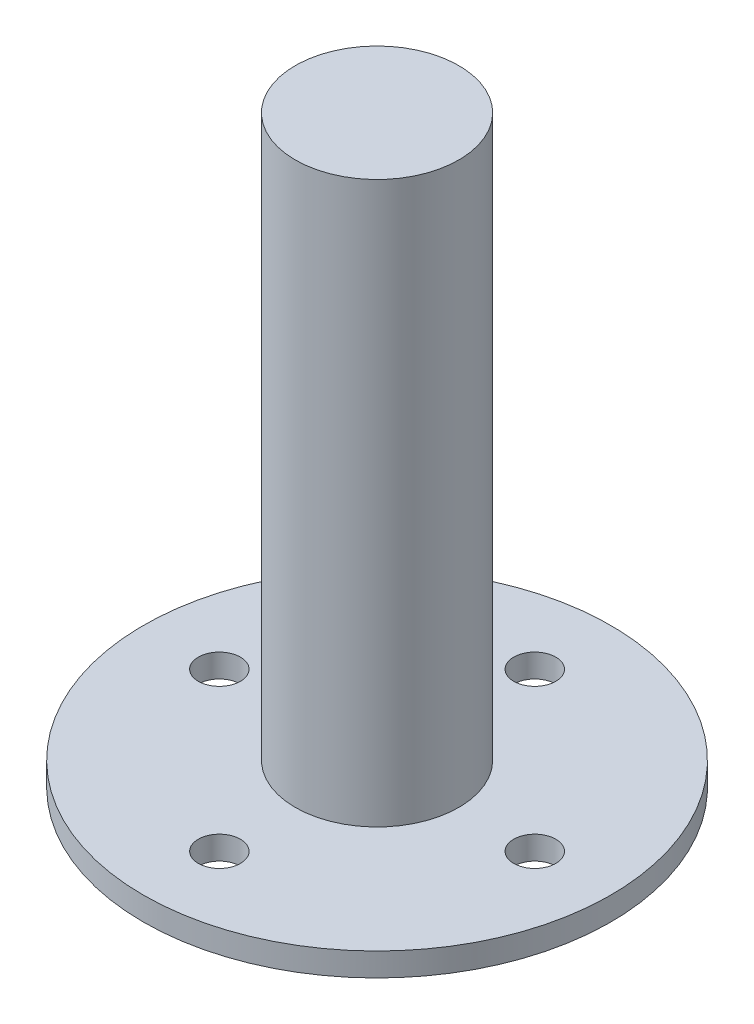
ISO-10303-21;
HEADER;
FILE_DESCRIPTION(('STEP AP214'),'2;1');
FILE_NAME('part.step','',(''),(''),'','','');
FILE_SCHEMA(('AUTOMOTIVE_DESIGN { 1 0 10303 214 1 1 1 1 }'));
ENDSEC;
DATA;
#1=APPLICATION_CONTEXT('core data for automotive mechanical design processes');
#2=APPLICATION_PROTOCOL_DEFINITION('international standard','automotive_design',2000,#1);
#3=PRODUCT_CONTEXT('',#1,'mechanical');
#4=PRODUCT('Part','Part','',(#3));
#5=PRODUCT_RELATED_PRODUCT_CATEGORY('part','',(#4));
#6=PRODUCT_DEFINITION_FORMATION('','',#4);
#7=PRODUCT_DEFINITION_CONTEXT('part definition',#1,'design');
#8=PRODUCT_DEFINITION('design','',#6,#7);
#9=PRODUCT_DEFINITION_SHAPE('','',#8);
#10=(LENGTH_UNIT() NAMED_UNIT(*) SI_UNIT(.MILLI.,.METRE.));
#11=(NAMED_UNIT(*) PLANE_ANGLE_UNIT() SI_UNIT($,.RADIAN.));
#12=(NAMED_UNIT(*) SI_UNIT($,.STERADIAN.) SOLID_ANGLE_UNIT());
#13=UNCERTAINTY_MEASURE_WITH_UNIT(LENGTH_MEASURE(1.E-05),#10,'distance_accuracy_value','');
#14=(GEOMETRIC_REPRESENTATION_CONTEXT(3) GLOBAL_UNCERTAINTY_ASSIGNED_CONTEXT((#13)) GLOBAL_UNIT_ASSIGNED_CONTEXT((#10,
#11,#12)) REPRESENTATION_CONTEXT('',''));
#15=CARTESIAN_POINT('',(0.,0.,0.));
#16=DIRECTION('',(0.,0.,1.));
#17=DIRECTION('',(1.,0.,0.));
#18=AXIS2_PLACEMENT_3D('',#15,#16,#17);
#19=CARTESIAN_POINT('',(0.,5.,0.));
#20=DIRECTION('',(0.,-1.,0.));
#21=DIRECTION('',(0.,0.,-1.));
#22=AXIS2_PLACEMENT_3D('',#19,#20,#21);
#23=CYLINDRICAL_SURFACE('',#22,50.);
#24=CARTESIAN_POINT('',(0.,5.,0.));
#25=DIRECTION('',(0.,1.,0.));
#26=DIRECTION('',(0.,0.,1.));
#27=AXIS2_PLACEMENT_3D('',#24,#25,#26);
#28=CIRCLE('',#27,50.);
#29=CARTESIAN_POINT('',(0.,5.,50.));
#30=VERTEX_POINT('',#29);
#31=EDGE_CURVE('E44',#30,#30,#28,.T.);
#32=ORIENTED_EDGE('',*,*,#31,.F.);
#33=EDGE_LOOP('',(#32));
#34=FACE_BOUND('',#33,.T.);
#35=CARTESIAN_POINT('',(0.,0.,0.));
#36=DIRECTION('',(0.,1.,0.));
#37=DIRECTION('',(0.,0.,1.));
#38=AXIS2_PLACEMENT_3D('',#35,#36,#37);
#39=CIRCLE('',#38,50.);
#40=CARTESIAN_POINT('',(0.,0.,50.));
#41=VERTEX_POINT('',#40);
#42=EDGE_CURVE('E40',#41,#41,#39,.T.);
#43=ORIENTED_EDGE('',*,*,#42,.T.);
#44=EDGE_LOOP('',(#43));
#45=FACE_BOUND('',#44,.T.);
#46=ADVANCED_FACE('F37',(#34,#45),#23,.T.);
#47=CARTESIAN_POINT('',(0.,5.,0.));
#48=DIRECTION('',(0.,1.,0.));
#49=DIRECTION('',(0.,0.,1.));
#50=AXIS2_PLACEMENT_3D('',#47,#48,#49);
#51=PLANE('',#50);
#52=CARTESIAN_POINT('',(-33.75,5.,-2.28983498828939E-13));
#53=DIRECTION('',(0.,1.,0.));
#54=DIRECTION('',(0.,0.,1.));
#55=AXIS2_PLACEMENT_3D('',#52,#53,#54);
#56=CIRCLE('',#55,4.5);
#57=CARTESIAN_POINT('',(-33.75,5.,4.49999999999977));
#58=VERTEX_POINT('',#57);
#59=EDGE_CURVE('E74',#58,#58,#56,.T.);
#60=ORIENTED_EDGE('',*,*,#59,.F.);
#61=EDGE_LOOP('',(#60));
#62=FACE_BOUND('',#61,.T.);
#63=CARTESIAN_POINT('',(2.32452945780892E-13,5.,-33.75));
#64=DIRECTION('',(0.,1.,0.));
#65=DIRECTION('',(0.,0.,1.));
#66=AXIS2_PLACEMENT_3D('',#63,#64,#65);
#67=CIRCLE('',#66,4.5);
#68=CARTESIAN_POINT('',(2.32452945780892E-13,5.,-29.25));
#69=VERTEX_POINT('',#68);
#70=EDGE_CURVE('E68',#69,#69,#67,.T.);
#71=ORIENTED_EDGE('',*,*,#70,.F.);
#72=EDGE_LOOP('',(#71));
#73=FACE_BOUND('',#72,.T.);
#74=CARTESIAN_POINT('',(-2.28983498828939E-13,5.,33.75));
#75=DIRECTION('',(0.,1.,0.));
#76=DIRECTION('',(0.,0.,1.));
#77=AXIS2_PLACEMENT_3D('',#74,#75,#76);
#78=CIRCLE('',#77,4.5);
#79=CARTESIAN_POINT('',(-2.28983498828939E-13,5.,38.25));
#80=VERTEX_POINT('',#79);
#81=EDGE_CURVE('E62',#80,#80,#78,.T.);
#82=ORIENTED_EDGE('',*,*,#81,.F.);
#83=EDGE_LOOP('',(#82));
#84=FACE_BOUND('',#83,.T.);
#85=CARTESIAN_POINT('',(33.75,5.,2.28983498828939E-13));
#86=DIRECTION('',(0.,1.,0.));
#87=DIRECTION('',(0.,0.,1.));
#88=AXIS2_PLACEMENT_3D('',#85,#86,#87);
#89=CIRCLE('',#88,4.5);
#90=CARTESIAN_POINT('',(33.75,5.,4.50000000000023));
#91=VERTEX_POINT('',#90);
#92=EDGE_CURVE('E56',#91,#91,#89,.T.);
#93=ORIENTED_EDGE('',*,*,#92,.F.);
#94=EDGE_LOOP('',(#93));
#95=FACE_BOUND('',#94,.T.);
#96=CARTESIAN_POINT('',(0.,5.,0.));
#97=DIRECTION('',(0.,1.,0.));
#98=DIRECTION('',(0.,0.,1.));
#99=AXIS2_PLACEMENT_3D('',#96,#97,#98);
#100=CIRCLE('',#99,17.5);
#101=CARTESIAN_POINT('',(0.,5.,17.5));
#102=VERTEX_POINT('',#101);
#103=EDGE_CURVE('E10',#102,#102,#100,.T.);
#104=ORIENTED_EDGE('',*,*,#103,.F.);
#105=EDGE_LOOP('',(#104));
#106=FACE_BOUND('',#105,.T.);
#107=ORIENTED_EDGE('',*,*,#31,.T.);
#108=EDGE_LOOP('',(#107));
#109=FACE_BOUND('',#108,.T.);
#110=ADVANCED_FACE('F80',(#62,#73,#84,#95,#106,#109),#51,.T.);
#111=CARTESIAN_POINT('',(0.,0.,0.));
#112=DIRECTION('',(0.,1.,0.));
#113=DIRECTION('',(0.,0.,1.));
#114=AXIS2_PLACEMENT_3D('',#111,#112,#113);
#115=PLANE('',#114);
#116=CARTESIAN_POINT('',(-33.75,0.,-2.28983498828939E-13));
#117=DIRECTION('',(0.,1.,0.));
#118=DIRECTION('',(0.,0.,1.));
#119=AXIS2_PLACEMENT_3D('',#116,#117,#118);
#120=CIRCLE('',#119,4.5);
#121=CARTESIAN_POINT('',(-33.75,0.,4.49999999999977));
#122=VERTEX_POINT('',#121);
#123=EDGE_CURVE('E71',#122,#122,#120,.T.);
#124=ORIENTED_EDGE('',*,*,#123,.T.);
#125=EDGE_LOOP('',(#124));
#126=FACE_BOUND('',#125,.T.);
#127=CARTESIAN_POINT('',(2.32452945780892E-13,0.,-33.75));
#128=DIRECTION('',(0.,1.,0.));
#129=DIRECTION('',(0.,0.,1.));
#130=AXIS2_PLACEMENT_3D('',#127,#128,#129);
#131=CIRCLE('',#130,4.5);
#132=CARTESIAN_POINT('',(2.32452945780892E-13,0.,-29.25));
#133=VERTEX_POINT('',#132);
#134=EDGE_CURVE('E65',#133,#133,#131,.T.);
#135=ORIENTED_EDGE('',*,*,#134,.T.);
#136=EDGE_LOOP('',(#135));
#137=FACE_BOUND('',#136,.T.);
#138=CARTESIAN_POINT('',(-2.28983498828939E-13,0.,33.75));
#139=DIRECTION('',(0.,1.,0.));
#140=DIRECTION('',(0.,0.,1.));
#141=AXIS2_PLACEMENT_3D('',#138,#139,#140);
#142=CIRCLE('',#141,4.5);
#143=CARTESIAN_POINT('',(-2.28983498828939E-13,0.,38.25));
#144=VERTEX_POINT('',#143);
#145=EDGE_CURVE('E59',#144,#144,#142,.T.);
#146=ORIENTED_EDGE('',*,*,#145,.T.);
#147=EDGE_LOOP('',(#146));
#148=FACE_BOUND('',#147,.T.);
#149=CARTESIAN_POINT('',(33.75,0.,2.28983498828939E-13));
#150=DIRECTION('',(0.,1.,0.));
#151=DIRECTION('',(0.,0.,1.));
#152=AXIS2_PLACEMENT_3D('',#149,#150,#151);
#153=CIRCLE('',#152,4.5);
#154=CARTESIAN_POINT('',(33.75,0.,4.50000000000023));
#155=VERTEX_POINT('',#154);
#156=EDGE_CURVE('E53',#155,#155,#153,.T.);
#157=ORIENTED_EDGE('',*,*,#156,.T.);
#158=EDGE_LOOP('',(#157));
#159=FACE_BOUND('',#158,.T.);
#160=ORIENTED_EDGE('',*,*,#42,.F.);
#161=EDGE_LOOP('',(#160));
#162=FACE_BOUND('',#161,.T.);
#163=ADVANCED_FACE('F83',(#126,#137,#148,#159,#162),#115,.F.);
#164=CARTESIAN_POINT('',(0.,125.,0.));
#165=DIRECTION('',(0.,-1.,0.));
#166=DIRECTION('',(0.,0.,-1.));
#167=AXIS2_PLACEMENT_3D('',#164,#165,#166);
#168=CYLINDRICAL_SURFACE('',#167,17.5);
#169=CARTESIAN_POINT('',(0.,125.,0.));
#170=DIRECTION('',(0.,1.,0.));
#171=DIRECTION('',(0.,0.,1.));
#172=AXIS2_PLACEMENT_3D('',#169,#170,#171);
#173=CIRCLE('',#172,17.5);
#174=CARTESIAN_POINT('',(0.,125.,17.5));
#175=VERTEX_POINT('',#174);
#176=EDGE_CURVE('E50',#175,#175,#173,.T.);
#177=ORIENTED_EDGE('',*,*,#176,.F.);
#178=EDGE_LOOP('',(#177));
#179=FACE_BOUND('',#178,.T.);
#180=ORIENTED_EDGE('',*,*,#103,.T.);
#181=EDGE_LOOP('',(#180));
#182=FACE_BOUND('',#181,.T.);
#183=ADVANCED_FACE('F100',(#179,#182),#168,.T.);
#184=CARTESIAN_POINT('',(0.,125.,0.));
#185=DIRECTION('',(0.,1.,0.));
#186=DIRECTION('',(0.,0.,1.));
#187=AXIS2_PLACEMENT_3D('',#184,#185,#186);
#188=PLANE('',#187);
#189=ORIENTED_EDGE('',*,*,#176,.T.);
#190=EDGE_LOOP('',(#189));
#191=FACE_BOUND('',#190,.T.);
#192=ADVANCED_FACE('F105',(#191),#188,.T.);
#193=CARTESIAN_POINT('',(33.75,5.,2.28983498828939E-13));
#194=DIRECTION('',(0.,1.,0.));
#195=DIRECTION('',(0.,0.,1.));
#196=AXIS2_PLACEMENT_3D('',#193,#194,#195);
#197=CYLINDRICAL_SURFACE('',#196,4.5);
#198=ORIENTED_EDGE('',*,*,#156,.F.);
#199=EDGE_LOOP('',(#198));
#200=FACE_BOUND('',#199,.T.);
#201=ORIENTED_EDGE('',*,*,#92,.T.);
#202=EDGE_LOOP('',(#201));
#203=FACE_BOUND('',#202,.T.);
#204=ADVANCED_FACE('F112',(#200,#203),#197,.F.);
#205=CARTESIAN_POINT('',(-2.28983498828939E-13,5.,33.75));
#206=DIRECTION('',(0.,1.,0.));
#207=DIRECTION('',(0.,0.,1.));
#208=AXIS2_PLACEMENT_3D('',#205,#206,#207);
#209=CYLINDRICAL_SURFACE('',#208,4.5);
#210=ORIENTED_EDGE('',*,*,#145,.F.);
#211=EDGE_LOOP('',(#210));
#212=FACE_BOUND('',#211,.T.);
#213=ORIENTED_EDGE('',*,*,#81,.T.);
#214=EDGE_LOOP('',(#213));
#215=FACE_BOUND('',#214,.T.);
#216=ADVANCED_FACE('F116',(#212,#215),#209,.F.);
#217=CARTESIAN_POINT('',(2.32452945780892E-13,5.,-33.75));
#218=DIRECTION('',(0.,1.,0.));
#219=DIRECTION('',(0.,0.,1.));
#220=AXIS2_PLACEMENT_3D('',#217,#218,#219);
#221=CYLINDRICAL_SURFACE('',#220,4.5);
#222=ORIENTED_EDGE('',*,*,#134,.F.);
#223=EDGE_LOOP('',(#222));
#224=FACE_BOUND('',#223,.T.);
#225=ORIENTED_EDGE('',*,*,#70,.T.);
#226=EDGE_LOOP('',(#225));
#227=FACE_BOUND('',#226,.T.);
#228=ADVANCED_FACE('F120',(#224,#227),#221,.F.);
#229=CARTESIAN_POINT('',(-33.75,5.,-2.28983498828939E-13));
#230=DIRECTION('',(0.,1.,0.));
#231=DIRECTION('',(0.,0.,1.));
#232=AXIS2_PLACEMENT_3D('',#229,#230,#231);
#233=CYLINDRICAL_SURFACE('',#232,4.5);
#234=ORIENTED_EDGE('',*,*,#123,.F.);
#235=EDGE_LOOP('',(#234));
#236=FACE_BOUND('',#235,.T.);
#237=ORIENTED_EDGE('',*,*,#59,.T.);
#238=EDGE_LOOP('',(#237));
#239=FACE_BOUND('',#238,.T.);
#240=ADVANCED_FACE('F78',(#236,#239),#233,.F.);
#241=CLOSED_SHELL('',(#46,#110,#163,#183,#192,#204,#216,#228,#240));
#242=MANIFOLD_SOLID_BREP('B2',#241);
#243=ADVANCED_BREP_SHAPE_REPRESENTATION('',(#18,#242),#14);
#244=SHAPE_DEFINITION_REPRESENTATION(#9,#243);
ENDSEC;
END-ISO-10303-21;
